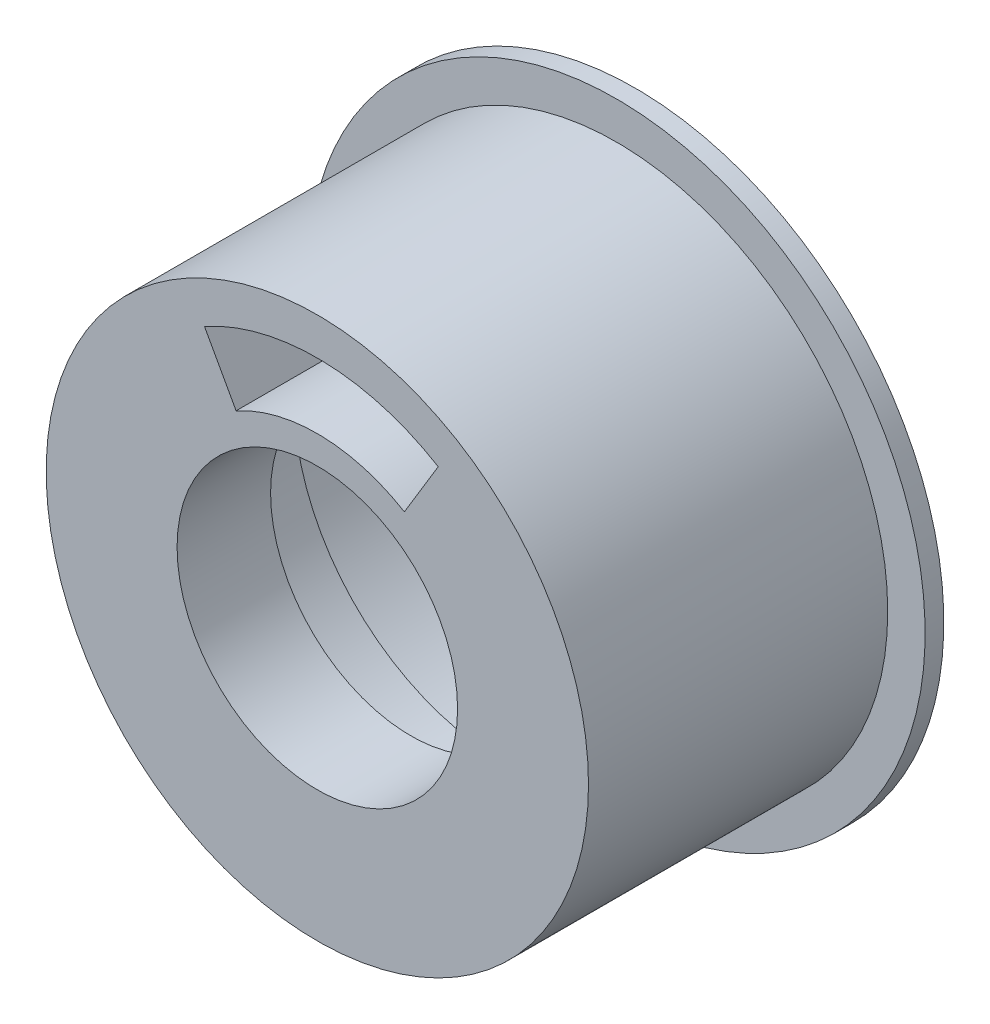
ISO-10303-21;
HEADER;
FILE_DESCRIPTION(('STEP AP214'),'2;1');
FILE_NAME('part.step','',(''),(''),'','','');
FILE_SCHEMA(('AUTOMOTIVE_DESIGN { 1 0 10303 214 1 1 1 1 }'));
ENDSEC;
DATA;
#1=APPLICATION_CONTEXT('core data for automotive mechanical design processes');
#2=APPLICATION_PROTOCOL_DEFINITION('international standard','automotive_design',2000,#1);
#3=PRODUCT_CONTEXT('',#1,'mechanical');
#4=PRODUCT('Part','Part','',(#3));
#5=PRODUCT_RELATED_PRODUCT_CATEGORY('part','',(#4));
#6=PRODUCT_DEFINITION_FORMATION('','',#4);
#7=PRODUCT_DEFINITION_CONTEXT('part definition',#1,'design');
#8=PRODUCT_DEFINITION('design','',#6,#7);
#9=PRODUCT_DEFINITION_SHAPE('','',#8);
#10=(LENGTH_UNIT() NAMED_UNIT(*) SI_UNIT(.MILLI.,.METRE.));
#11=(NAMED_UNIT(*) PLANE_ANGLE_UNIT() SI_UNIT($,.RADIAN.));
#12=(NAMED_UNIT(*) SI_UNIT($,.STERADIAN.) SOLID_ANGLE_UNIT());
#13=UNCERTAINTY_MEASURE_WITH_UNIT(LENGTH_MEASURE(1.E-05),#10,'distance_accuracy_value','');
#14=(GEOMETRIC_REPRESENTATION_CONTEXT(3) GLOBAL_UNCERTAINTY_ASSIGNED_CONTEXT((#13)) GLOBAL_UNIT_ASSIGNED_CONTEXT((#10,
#11,#12)) REPRESENTATION_CONTEXT('',''));
#15=CARTESIAN_POINT('',(0.,0.,0.));
#16=DIRECTION('',(0.,0.,1.));
#17=DIRECTION('',(1.,0.,0.));
#18=AXIS2_PLACEMENT_3D('',#15,#16,#17);
#19=CARTESIAN_POINT('',(0.,0.,12.));
#20=DIRECTION('',(0.,0.,-1.));
#21=DIRECTION('',(-1.,0.,0.));
#22=AXIS2_PLACEMENT_3D('',#19,#20,#21);
#23=CYLINDRICAL_SURFACE('',#22,29.);
#24=CARTESIAN_POINT('',(0.,0.,0.));
#25=DIRECTION('',(0.,0.,1.));
#26=DIRECTION('',(1.,0.,0.));
#27=AXIS2_PLACEMENT_3D('',#24,#25,#26);
#28=CIRCLE('',#27,29.);
#29=CARTESIAN_POINT('',(29.,0.,0.));
#30=VERTEX_POINT('',#29);
#31=EDGE_CURVE('E44',#30,#30,#28,.T.);
#32=ORIENTED_EDGE('',*,*,#31,.T.);
#33=EDGE_LOOP('',(#32));
#34=FACE_BOUND('',#33,.T.);
#35=CARTESIAN_POINT('',(0.,0.,32.));
#36=DIRECTION('',(0.,0.,1.));
#37=DIRECTION('',(1.,0.,0.));
#38=AXIS2_PLACEMENT_3D('',#35,#36,#37);
#39=CIRCLE('',#38,29.);
#40=CARTESIAN_POINT('',(29.,0.,32.));
#41=VERTEX_POINT('',#40);
#42=EDGE_CURVE('E144',#41,#41,#39,.T.);
#43=ORIENTED_EDGE('',*,*,#42,.F.);
#44=EDGE_LOOP('',(#43));
#45=FACE_BOUND('',#44,.T.);
#46=ADVANCED_FACE('F41',(#34,#45),#23,.T.);
#47=CARTESIAN_POINT('',(0.,0.,12.));
#48=DIRECTION('',(0.,0.,-1.));
#49=DIRECTION('',(-1.,0.,0.));
#50=AXIS2_PLACEMENT_3D('',#47,#48,#49);
#51=CYLINDRICAL_SURFACE('',#50,26.);
#52=CARTESIAN_POINT('',(0.,0.,12.));
#53=DIRECTION('',(0.,0.,1.));
#54=DIRECTION('',(1.,0.,0.));
#55=AXIS2_PLACEMENT_3D('',#52,#53,#54);
#56=CIRCLE('',#55,26.);
#57=CARTESIAN_POINT('',(26.,0.,12.));
#58=VERTEX_POINT('',#57);
#59=EDGE_CURVE('E11',#58,#58,#56,.T.);
#60=ORIENTED_EDGE('',*,*,#59,.T.);
#61=EDGE_LOOP('',(#60));
#62=FACE_BOUND('',#61,.T.);
#63=CARTESIAN_POINT('',(0.,0.,-2.));
#64=DIRECTION('',(0.,0.,-1.));
#65=DIRECTION('',(-1.,0.,0.));
#66=AXIS2_PLACEMENT_3D('',#63,#64,#65);
#67=CIRCLE('',#66,26.);
#68=CARTESIAN_POINT('',(-26.,0.,-2.));
#69=VERTEX_POINT('',#68);
#70=EDGE_CURVE('E175',#69,#69,#67,.T.);
#71=ORIENTED_EDGE('',*,*,#70,.T.);
#72=EDGE_LOOP('',(#71));
#73=FACE_BOUND('',#72,.T.);
#74=ADVANCED_FACE('F181',(#62,#73),#51,.F.);
#75=CARTESIAN_POINT('',(0.,0.,12.));
#76=DIRECTION('',(0.,0.,1.));
#77=DIRECTION('',(1.,0.,0.));
#78=AXIS2_PLACEMENT_3D('',#75,#76,#77);
#79=PLANE('',#78);
#80=CARTESIAN_POINT('',(0.,0.,12.));
#81=DIRECTION('',(0.,0.,1.));
#82=DIRECTION('',(1.,0.,0.));
#83=AXIS2_PLACEMENT_3D('',#80,#81,#82);
#84=CIRCLE('',#83,22.5);
#85=CARTESIAN_POINT('',(-10.8621142585485,19.7044277723114,12.));
#86=VERTEX_POINT('',#85);
#87=CARTESIAN_POINT('',(11.6334778885831,19.2590807728679,12.));
#88=VERTEX_POINT('',#87);
#89=EDGE_CURVE('E49',#86,#88,#84,.T.);
#90=ORIENTED_EDGE('',*,*,#89,.T.);
#91=DIRECTION('',(0.517043461714804,0.855959145460793,0.));
#92=VECTOR('',#91,1.);
#93=CARTESIAN_POINT('',(0.,0.,12.));
#94=LINE('',#93,#92);
#95=CARTESIAN_POINT('',(12.9260865428701,21.3989786365198,12.));
#96=VERTEX_POINT('',#95);
#97=EDGE_CURVE('E137',#88,#96,#94,.T.);
#98=ORIENTED_EDGE('',*,*,#97,.T.);
#99=CARTESIAN_POINT('',(0.,0.,12.));
#100=DIRECTION('',(0.,0.,1.));
#101=DIRECTION('',(1.,0.,0.));
#102=AXIS2_PLACEMENT_3D('',#99,#100,#101);
#103=CIRCLE('',#102,25.);
#104=CARTESIAN_POINT('',(-12.0690158428317,21.8938086359016,12.));
#105=VERTEX_POINT('',#104);
#106=EDGE_CURVE('E120',#96,#105,#103,.T.);
#107=ORIENTED_EDGE('',*,*,#106,.T.);
#108=DIRECTION('',(-0.482760633713267,0.875752345436063,0.));
#109=VECTOR('',#108,1.);
#110=CARTESIAN_POINT('',(0.,0.,12.));
#111=LINE('',#110,#109);
#112=EDGE_CURVE('E100',#86,#105,#111,.T.);
#113=ORIENTED_EDGE('',*,*,#112,.F.);
#114=EDGE_LOOP('',(#90,#98,#107,#113));
#115=FACE_BOUND('',#114,.T.);
#116=ORIENTED_EDGE('',*,*,#59,.F.);
#117=EDGE_LOOP('',(#116));
#118=FACE_BOUND('',#117,.T.);
#119=ADVANCED_FACE('F155',(#115,#118),#79,.F.);
#120=CARTESIAN_POINT('',(0.,0.,22.));
#121=DIRECTION('',(0.,0.,-1.));
#122=DIRECTION('',(-1.,0.,0.));
#123=AXIS2_PLACEMENT_3D('',#120,#121,#122);
#124=CYLINDRICAL_SURFACE('',#123,22.5);
#125=DIRECTION('',(0.,0.,-1.));
#126=VECTOR('',#125,1.);
#127=CARTESIAN_POINT('',(11.6334778885831,19.2590807728679,22.));
#128=LINE('',#127,#126);
#129=CARTESIAN_POINT('',(11.6334778885831,19.2590807728679,22.));
#130=VERTEX_POINT('',#129);
#131=EDGE_CURVE('E135',#88,#130,#128,.F.);
#132=ORIENTED_EDGE('',*,*,#131,.F.);
#133=ORIENTED_EDGE('',*,*,#89,.F.);
#134=DIRECTION('',(0.,0.,-1.));
#135=VECTOR('',#134,1.);
#136=CARTESIAN_POINT('',(-10.8621142585485,19.7044277723114,22.));
#137=LINE('',#136,#135);
#138=CARTESIAN_POINT('',(-10.8621142585485,19.7044277723114,22.));
#139=VERTEX_POINT('',#138);
#140=EDGE_CURVE('E126',#86,#139,#137,.F.);
#141=ORIENTED_EDGE('',*,*,#140,.T.);
#142=CARTESIAN_POINT('',(0.,0.,22.));
#143=DIRECTION('',(0.,0.,1.));
#144=DIRECTION('',(1.,0.,0.));
#145=AXIS2_PLACEMENT_3D('',#142,#143,#144);
#146=CIRCLE('',#145,22.5);
#147=EDGE_CURVE('E149',#139,#130,#146,.T.);
#148=ORIENTED_EDGE('',*,*,#147,.T.);
#149=EDGE_LOOP('',(#132,#133,#141,#148));
#150=FACE_BOUND('',#149,.T.);
#151=ADVANCED_FACE('F159',(#150),#124,.F.);
#152=CARTESIAN_POINT('',(0.,0.,22.));
#153=DIRECTION('',(0.,0.,1.));
#154=DIRECTION('',(1.,0.,0.));
#155=AXIS2_PLACEMENT_3D('',#152,#153,#154);
#156=PLANE('',#155);
#157=CARTESIAN_POINT('',(0.,0.,22.));
#158=DIRECTION('',(0.,0.,1.));
#159=DIRECTION('',(1.,0.,0.));
#160=AXIS2_PLACEMENT_3D('',#157,#158,#159);
#161=CIRCLE('',#160,15.);
#162=CARTESIAN_POINT('',(15.,0.,22.));
#163=VERTEX_POINT('',#162);
#164=EDGE_CURVE('E140',#163,#163,#161,.T.);
#165=ORIENTED_EDGE('',*,*,#164,.T.);
#166=EDGE_LOOP('',(#165));
#167=FACE_BOUND('',#166,.T.);
#168=CARTESIAN_POINT('',(0.,0.,22.));
#169=DIRECTION('',(0.,0.,1.));
#170=DIRECTION('',(1.,0.,0.));
#171=AXIS2_PLACEMENT_3D('',#168,#169,#170);
#172=CIRCLE('',#171,18.);
#173=CARTESIAN_POINT('',(9.30678231086648,15.4072646182943,22.));
#174=VERTEX_POINT('',#173);
#175=CARTESIAN_POINT('',(-8.6896914068388,15.7635422178491,22.));
#176=VERTEX_POINT('',#175);
#177=EDGE_CURVE('E130',#174,#176,#172,.T.);
#178=ORIENTED_EDGE('',*,*,#177,.F.);
#179=DIRECTION('',(0.517043461714804,0.855959145460793,0.));
#180=VECTOR('',#179,1.);
#181=CARTESIAN_POINT('',(0.,0.,22.));
#182=LINE('',#181,#180);
#183=EDGE_CURVE('E132',#174,#130,#182,.T.);
#184=ORIENTED_EDGE('',*,*,#183,.T.);
#185=ORIENTED_EDGE('',*,*,#147,.F.);
#186=DIRECTION('',(-0.482760633713267,0.875752345436063,0.));
#187=VECTOR('',#186,1.);
#188=CARTESIAN_POINT('',(0.,0.,22.));
#189=LINE('',#188,#187);
#190=EDGE_CURVE('E124',#176,#139,#189,.T.);
#191=ORIENTED_EDGE('',*,*,#190,.F.);
#192=EDGE_LOOP('',(#178,#184,#185,#191));
#193=FACE_BOUND('',#192,.T.);
#194=ADVANCED_FACE('F165',(#167,#193),#156,.F.);
#195=CARTESIAN_POINT('',(0.,0.,32.));
#196=DIRECTION('',(0.,0.,1.));
#197=DIRECTION('',(1.,0.,0.));
#198=AXIS2_PLACEMENT_3D('',#195,#196,#197);
#199=PLANE('',#198);
#200=DIRECTION('',(0.517043461714804,0.855959145460794,0.));
#201=VECTOR('',#200,1.);
#202=CARTESIAN_POINT('',(0.,0.,32.));
#203=LINE('',#202,#201);
#204=CARTESIAN_POINT('',(9.30678231086648,15.4072646182943,32.));
#205=VERTEX_POINT('',#204);
#206=CARTESIAN_POINT('',(12.9260865428701,21.3989786365198,32.));
#207=VERTEX_POINT('',#206);
#208=EDGE_CURVE('E64',#205,#207,#203,.T.);
#209=ORIENTED_EDGE('',*,*,#208,.F.);
#210=CARTESIAN_POINT('',(0.,0.,32.));
#211=DIRECTION('',(0.,0.,1.));
#212=DIRECTION('',(1.,0.,0.));
#213=AXIS2_PLACEMENT_3D('',#210,#211,#212);
#214=CIRCLE('',#213,18.);
#215=CARTESIAN_POINT('',(-8.6896914068388,15.7635422178491,32.));
#216=VERTEX_POINT('',#215);
#217=EDGE_CURVE('E113',#205,#216,#214,.T.);
#218=ORIENTED_EDGE('',*,*,#217,.T.);
#219=DIRECTION('',(-0.482760633713267,0.875752345436063,0.));
#220=VECTOR('',#219,1.);
#221=CARTESIAN_POINT('',(0.,0.,32.));
#222=LINE('',#221,#220);
#223=CARTESIAN_POINT('',(-12.0690158428317,21.8938086359016,32.));
#224=VERTEX_POINT('',#223);
#225=EDGE_CURVE('E97',#216,#224,#222,.T.);
#226=ORIENTED_EDGE('',*,*,#225,.T.);
#227=CARTESIAN_POINT('',(0.,0.,32.));
#228=DIRECTION('',(0.,0.,1.));
#229=DIRECTION('',(1.,0.,0.));
#230=AXIS2_PLACEMENT_3D('',#227,#228,#229);
#231=CIRCLE('',#230,25.);
#232=EDGE_CURVE('E106',#207,#224,#231,.T.);
#233=ORIENTED_EDGE('',*,*,#232,.F.);
#234=EDGE_LOOP('',(#209,#218,#226,#233));
#235=FACE_BOUND('',#234,.T.);
#236=ORIENTED_EDGE('',*,*,#42,.T.);
#237=EDGE_LOOP('',(#236));
#238=FACE_BOUND('',#237,.T.);
#239=CARTESIAN_POINT('',(0.,0.,32.));
#240=DIRECTION('',(0.,0.,1.));
#241=DIRECTION('',(1.,0.,0.));
#242=AXIS2_PLACEMENT_3D('',#239,#240,#241);
#243=CIRCLE('',#242,15.);
#244=CARTESIAN_POINT('',(15.,0.,32.));
#245=VERTEX_POINT('',#244);
#246=EDGE_CURVE('E141',#245,#245,#243,.T.);
#247=ORIENTED_EDGE('',*,*,#246,.F.);
#248=EDGE_LOOP('',(#247));
#249=FACE_BOUND('',#248,.T.);
#250=ADVANCED_FACE('F110',(#235,#238,#249),#199,.T.);
#251=CARTESIAN_POINT('',(0.,0.,32.));
#252=DIRECTION('',(0.,0.,-1.));
#253=DIRECTION('',(-1.,0.,0.));
#254=AXIS2_PLACEMENT_3D('',#251,#252,#253);
#255=CYLINDRICAL_SURFACE('',#254,15.);
#256=ORIENTED_EDGE('',*,*,#246,.T.);
#257=EDGE_LOOP('',(#256));
#258=FACE_BOUND('',#257,.T.);
#259=ORIENTED_EDGE('',*,*,#164,.F.);
#260=EDGE_LOOP('',(#259));
#261=FACE_BOUND('',#260,.T.);
#262=ADVANCED_FACE('F208',(#258,#261),#255,.F.);
#263=CARTESIAN_POINT('',(0.,0.,-1.00000000000001));
#264=DIRECTION('',(0.855959145460793,-0.517043461714804,0.));
#265=DIRECTION('',(0.517043461714804,0.855959145460793,0.));
#266=AXIS2_PLACEMENT_3D('',#263,#264,#265);
#267=PLANE('',#266);
#268=ORIENTED_EDGE('',*,*,#131,.T.);
#269=ORIENTED_EDGE('',*,*,#183,.F.);
#270=DIRECTION('',(0.,0.,1.));
#271=VECTOR('',#270,1.);
#272=CARTESIAN_POINT('',(9.30678231086648,15.4072646182943,-1.00000000000001));
#273=LINE('',#272,#271);
#274=EDGE_CURVE('E118',#174,#205,#273,.T.);
#275=ORIENTED_EDGE('',*,*,#274,.T.);
#276=ORIENTED_EDGE('',*,*,#208,.T.);
#277=DIRECTION('',(0.,0.,1.));
#278=VECTOR('',#277,1.);
#279=CARTESIAN_POINT('',(12.9260865428701,21.3989786365198,-1.00000000000001));
#280=LINE('',#279,#278);
#281=EDGE_CURVE('E103',#96,#207,#280,.T.);
#282=ORIENTED_EDGE('',*,*,#281,.F.);
#283=ORIENTED_EDGE('',*,*,#97,.F.);
#284=EDGE_LOOP('',(#268,#269,#275,#276,#282,#283));
#285=FACE_BOUND('',#284,.T.);
#286=ADVANCED_FACE('F161',(#285),#267,.F.);
#287=CARTESIAN_POINT('',(0.,0.,-1.00000000000001));
#288=DIRECTION('',(0.,0.,1.));
#289=DIRECTION('',(1.,0.,0.));
#290=AXIS2_PLACEMENT_3D('',#287,#288,#289);
#291=CYLINDRICAL_SURFACE('',#290,18.);
#292=ORIENTED_EDGE('',*,*,#177,.T.);
#293=DIRECTION('',(0.,0.,1.));
#294=VECTOR('',#293,1.);
#295=CARTESIAN_POINT('',(-8.6896914068388,15.7635422178491,-1.00000000000001));
#296=LINE('',#295,#294);
#297=EDGE_CURVE('E56',#176,#216,#296,.T.);
#298=ORIENTED_EDGE('',*,*,#297,.T.);
#299=ORIENTED_EDGE('',*,*,#217,.F.);
#300=ORIENTED_EDGE('',*,*,#274,.F.);
#301=EDGE_LOOP('',(#292,#298,#299,#300));
#302=FACE_BOUND('',#301,.T.);
#303=ADVANCED_FACE('F168',(#302),#291,.T.);
#304=CARTESIAN_POINT('',(0.,0.,-1.00000000000001));
#305=DIRECTION('',(0.875752345436063,0.482760633713267,0.));
#306=DIRECTION('',(-0.482760633713267,0.875752345436063,0.));
#307=AXIS2_PLACEMENT_3D('',#304,#305,#306);
#308=PLANE('',#307);
#309=ORIENTED_EDGE('',*,*,#112,.T.);
#310=DIRECTION('',(0.,0.,1.));
#311=VECTOR('',#310,1.);
#312=CARTESIAN_POINT('',(-12.0690158428317,21.8938086359016,-1.00000000000001));
#313=LINE('',#312,#311);
#314=EDGE_CURVE('E93',#105,#224,#313,.T.);
#315=ORIENTED_EDGE('',*,*,#314,.T.);
#316=ORIENTED_EDGE('',*,*,#225,.F.);
#317=ORIENTED_EDGE('',*,*,#297,.F.);
#318=ORIENTED_EDGE('',*,*,#190,.T.);
#319=ORIENTED_EDGE('',*,*,#140,.F.);
#320=EDGE_LOOP('',(#309,#315,#316,#317,#318,#319));
#321=FACE_BOUND('',#320,.T.);
#322=ADVANCED_FACE('F95',(#321),#308,.T.);
#323=CARTESIAN_POINT('',(0.,0.,-1.00000000000001));
#324=DIRECTION('',(0.,0.,1.));
#325=DIRECTION('',(1.,0.,0.));
#326=AXIS2_PLACEMENT_3D('',#323,#324,#325);
#327=CYLINDRICAL_SURFACE('',#326,25.);
#328=ORIENTED_EDGE('',*,*,#281,.T.);
#329=ORIENTED_EDGE('',*,*,#232,.T.);
#330=ORIENTED_EDGE('',*,*,#314,.F.);
#331=ORIENTED_EDGE('',*,*,#106,.F.);
#332=EDGE_LOOP('',(#328,#329,#330,#331));
#333=FACE_BOUND('',#332,.T.);
#334=ADVANCED_FACE('F107',(#333),#327,.F.);
#335=CARTESIAN_POINT('',(0.,0.,-2.));
#336=DIRECTION('',(0.,0.,-1.));
#337=DIRECTION('',(-1.,0.,0.));
#338=AXIS2_PLACEMENT_3D('',#335,#336,#337);
#339=PLANE('',#338);
#340=CARTESIAN_POINT('',(0.,0.,-2.));
#341=DIRECTION('',(0.,0.,-1.));
#342=DIRECTION('',(-1.,0.,0.));
#343=AXIS2_PLACEMENT_3D('',#340,#341,#342);
#344=CIRCLE('',#343,33.);
#345=CARTESIAN_POINT('',(-33.,0.,-2.));
#346=VERTEX_POINT('',#345);
#347=EDGE_CURVE('E170',#346,#346,#344,.T.);
#348=ORIENTED_EDGE('',*,*,#347,.T.);
#349=EDGE_LOOP('',(#348));
#350=FACE_BOUND('',#349,.T.);
#351=ORIENTED_EDGE('',*,*,#70,.F.);
#352=EDGE_LOOP('',(#351));
#353=FACE_BOUND('',#352,.T.);
#354=ADVANCED_FACE('F183',(#350,#353),#339,.T.);
#355=CARTESIAN_POINT('',(0.,0.,0.));
#356=DIRECTION('',(0.,0.,-1.));
#357=DIRECTION('',(-1.,0.,0.));
#358=AXIS2_PLACEMENT_3D('',#355,#356,#357);
#359=PLANE('',#358);
#360=ORIENTED_EDGE('',*,*,#31,.F.);
#361=EDGE_LOOP('',(#360));
#362=FACE_BOUND('',#361,.T.);
#363=CARTESIAN_POINT('',(0.,0.,0.));
#364=DIRECTION('',(0.,0.,-1.));
#365=DIRECTION('',(-1.,0.,0.));
#366=AXIS2_PLACEMENT_3D('',#363,#364,#365);
#367=CIRCLE('',#366,33.);
#368=CARTESIAN_POINT('',(-33.,0.,0.));
#369=VERTEX_POINT('',#368);
#370=EDGE_CURVE('E172',#369,#369,#367,.T.);
#371=ORIENTED_EDGE('',*,*,#370,.F.);
#372=EDGE_LOOP('',(#371));
#373=FACE_BOUND('',#372,.T.);
#374=ADVANCED_FACE('F185',(#362,#373),#359,.F.);
#375=CARTESIAN_POINT('',(0.,0.,-2.));
#376=DIRECTION('',(0.,0.,1.));
#377=DIRECTION('',(1.,0.,0.));
#378=AXIS2_PLACEMENT_3D('',#375,#376,#377);
#379=CYLINDRICAL_SURFACE('',#378,33.);
#380=ORIENTED_EDGE('',*,*,#347,.F.);
#381=EDGE_LOOP('',(#380));
#382=FACE_BOUND('',#381,.T.);
#383=ORIENTED_EDGE('',*,*,#370,.T.);
#384=EDGE_LOOP('',(#383));
#385=FACE_BOUND('',#384,.T.);
#386=ADVANCED_FACE('F192',(#382,#385),#379,.T.);
#387=CLOSED_SHELL('',(#46,#74,#119,#151,#194,#250,#262,#286,#303,#322,#334,#354,#374,#386));
#388=MANIFOLD_SOLID_BREP('B2',#387);
#389=ADVANCED_BREP_SHAPE_REPRESENTATION('',(#18,#388),#14);
#390=SHAPE_DEFINITION_REPRESENTATION(#9,#389);
ENDSEC;
END-ISO-10303-21;
